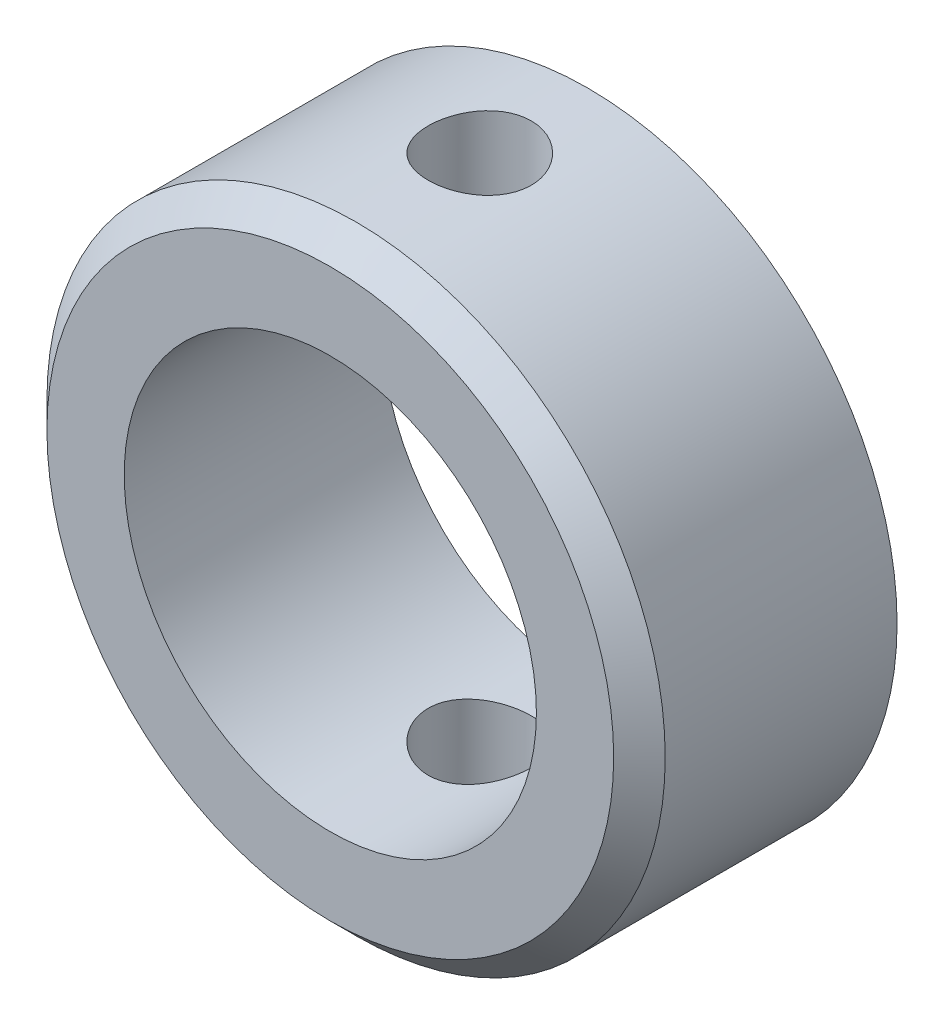
ISO-10303-21;
HEADER;
FILE_DESCRIPTION(('STEP AP214'),'2;1');
FILE_NAME('part.step','',(''),(''),'','','');
FILE_SCHEMA(('AUTOMOTIVE_DESIGN { 1 0 10303 214 1 1 1 1 }'));
ENDSEC;
DATA;
#1=APPLICATION_CONTEXT('core data for automotive mechanical design processes');
#2=APPLICATION_PROTOCOL_DEFINITION('international standard','automotive_design',2000,#1);
#3=PRODUCT_CONTEXT('',#1,'mechanical');
#4=PRODUCT('Part','Part','',(#3));
#5=PRODUCT_RELATED_PRODUCT_CATEGORY('part','',(#4));
#6=PRODUCT_DEFINITION_FORMATION('','',#4);
#7=PRODUCT_DEFINITION_CONTEXT('part definition',#1,'design');
#8=PRODUCT_DEFINITION('design','',#6,#7);
#9=PRODUCT_DEFINITION_SHAPE('','',#8);
#10=(LENGTH_UNIT() NAMED_UNIT(*) SI_UNIT(.MILLI.,.METRE.));
#11=(NAMED_UNIT(*) PLANE_ANGLE_UNIT() SI_UNIT($,.RADIAN.));
#12=(NAMED_UNIT(*) SI_UNIT($,.STERADIAN.) SOLID_ANGLE_UNIT());
#13=UNCERTAINTY_MEASURE_WITH_UNIT(LENGTH_MEASURE(1.E-05),#10,'distance_accuracy_value','');
#14=(GEOMETRIC_REPRESENTATION_CONTEXT(3) GLOBAL_UNCERTAINTY_ASSIGNED_CONTEXT((#13)) GLOBAL_UNIT_ASSIGNED_CONTEXT((#10,
#11,#12)) REPRESENTATION_CONTEXT('',''));
#15=CARTESIAN_POINT('',(0.,0.,0.));
#16=DIRECTION('',(0.,0.,1.));
#17=DIRECTION('',(1.,0.,0.));
#18=AXIS2_PLACEMENT_3D('',#15,#16,#17);
#19=CARTESIAN_POINT('',(0.,0.,10.));
#20=DIRECTION('',(0.,0.,1.));
#21=DIRECTION('',(1.,0.,0.));
#22=AXIS2_PLACEMENT_3D('',#19,#20,#21);
#23=PLANE('',#22);
#24=CARTESIAN_POINT('',(0.,0.,10.));
#25=DIRECTION('',(0.,0.,1.));
#26=DIRECTION('',(1.,0.,0.));
#27=AXIS2_PLACEMENT_3D('',#24,#25,#26);
#28=CIRCLE('',#27,11.);
#29=CARTESIAN_POINT('',(11.,0.,10.));
#30=VERTEX_POINT('',#29);
#31=EDGE_CURVE('E54',#30,#30,#28,.T.);
#32=ORIENTED_EDGE('',*,*,#31,.T.);
#33=EDGE_LOOP('',(#32));
#34=FACE_BOUND('',#33,.T.);
#35=CARTESIAN_POINT('',(0.,0.,10.));
#36=DIRECTION('',(0.,0.,1.));
#37=DIRECTION('',(1.,0.,0.));
#38=AXIS2_PLACEMENT_3D('',#35,#36,#37);
#39=CIRCLE('',#38,8.00000000000001);
#40=CARTESIAN_POINT('',(8.00000000000001,0.,10.));
#41=VERTEX_POINT('',#40);
#42=EDGE_CURVE('E110',#41,#41,#39,.T.);
#43=ORIENTED_EDGE('',*,*,#42,.F.);
#44=EDGE_LOOP('',(#43));
#45=FACE_BOUND('',#44,.T.);
#46=ADVANCED_FACE('F39',(#34,#45),#23,.T.);
#47=CARTESIAN_POINT('',(0.,0.,0.));
#48=DIRECTION('',(0.,0.,1.));
#49=DIRECTION('',(1.,0.,0.));
#50=AXIS2_PLACEMENT_3D('',#47,#48,#49);
#51=PLANE('',#50);
#52=CARTESIAN_POINT('',(0.,0.,0.));
#53=DIRECTION('',(0.,0.,1.));
#54=DIRECTION('',(1.,0.,0.));
#55=AXIS2_PLACEMENT_3D('',#52,#53,#54);
#56=CIRCLE('',#55,12.);
#57=CARTESIAN_POINT('',(12.,0.,0.));
#58=VERTEX_POINT('',#57);
#59=EDGE_CURVE('E60',#58,#58,#56,.T.);
#60=ORIENTED_EDGE('',*,*,#59,.F.);
#61=EDGE_LOOP('',(#60));
#62=FACE_BOUND('',#61,.T.);
#63=CARTESIAN_POINT('',(0.,0.,0.));
#64=DIRECTION('',(0.,0.,1.));
#65=DIRECTION('',(1.,0.,0.));
#66=AXIS2_PLACEMENT_3D('',#63,#64,#65);
#67=CIRCLE('',#66,8.00000000000001);
#68=CARTESIAN_POINT('',(8.00000000000001,0.,0.));
#69=VERTEX_POINT('',#68);
#70=EDGE_CURVE('E113',#69,#69,#67,.T.);
#71=ORIENTED_EDGE('',*,*,#70,.T.);
#72=EDGE_LOOP('',(#71));
#73=FACE_BOUND('',#72,.T.);
#74=ADVANCED_FACE('F97',(#62,#73),#51,.F.);
#75=CARTESIAN_POINT('',(0.,0.,10.));
#76=DIRECTION('',(0.,0.,-1.));
#77=DIRECTION('',(-1.,0.,0.));
#78=AXIS2_PLACEMENT_3D('',#75,#76,#77);
#79=CYLINDRICAL_SURFACE('',#78,12.);
#80=CARTESIAN_POINT('',(0.,-12.,6.2));
#81=CARTESIAN_POINT('',(0.111512723966572,-11.9999980893506,6.19999552884175));
#82=CARTESIAN_POINT('',(0.223086305471057,-11.9984294233043,6.19064218002486));
#83=CARTESIAN_POINT('',(0.443104177338434,-11.9923227595311,6.15349147298774));
#84=CARTESIAN_POINT('',(0.551545494367397,-11.9877820313911,6.12567715447072));
#85=CARTESIAN_POINT('',(0.762083797770115,-11.9762405458916,6.0524676411258));
#86=CARTESIAN_POINT('',(0.86418589474552,-11.9692418012736,6.00708682748754));
#87=CARTESIAN_POINT('',(1.05931347358236,-11.9535538166566,5.90007016635809));
#88=CARTESIAN_POINT('',(1.15233999190287,-11.9448647700355,5.8384361780136));
#89=CARTESIAN_POINT('',(1.32757809143334,-11.9266665396665,5.70003593294363));
#90=CARTESIAN_POINT('',(1.40969032282797,-11.9171509745189,5.6231447082911));
#91=CARTESIAN_POINT('',(1.55991079892794,-11.8984210150139,5.45668162522175));
#92=CARTESIAN_POINT('',(1.62801815951278,-11.8892066397014,5.36710896683471));
#93=CARTESIAN_POINT('',(1.74869370048411,-11.8720605260783,5.17714322704236));
#94=CARTESIAN_POINT('',(1.8011636422888,-11.8641370327331,5.0766869305562));
#95=CARTESIAN_POINT('',(1.88844669232898,-11.8505583183574,4.8682323485595));
#96=CARTESIAN_POINT('',(1.92326099325249,-11.8449029441145,4.7602345730579));
#97=CARTESIAN_POINT('',(1.97393150222785,-11.8365642947421,4.54081578011477));
#98=CARTESIAN_POINT('',(1.98995922330832,-11.8338541478856,4.42943541079889));
#99=CARTESIAN_POINT('',(2.0031333802319,-11.8316315114932,4.20553577849322));
#100=CARTESIAN_POINT('',(2.0002811523112,-11.8321187956577,4.09301659666616));
#101=CARTESIAN_POINT('',(1.97591607871692,-11.8362114309085,3.87125771097964));
#102=CARTESIAN_POINT('',(1.95459590551182,-11.8397845865513,3.76199615716381));
#103=CARTESIAN_POINT('',(1.89420251232276,-11.8495959616881,3.54862294573669));
#104=CARTESIAN_POINT('',(1.85512868345579,-11.8558342725862,3.44451146488916));
#105=CARTESIAN_POINT('',(1.76014179687513,-11.8703078346728,3.24381694124727));
#106=CARTESIAN_POINT('',(1.70414873110377,-11.8785525368586,3.14727247513502));
#107=CARTESIAN_POINT('',(1.57696961404595,-11.8961033473201,2.96487647956929));
#108=CARTESIAN_POINT('',(1.50578233652343,-11.9054095412343,2.87902581403606));
#109=CARTESIAN_POINT('',(1.34918576972724,-11.9241762230383,2.71933913135412));
#110=CARTESIAN_POINT('',(1.2636111710985,-11.9336371938532,2.64566518516793));
#111=CARTESIAN_POINT('',(1.08122819918532,-11.9515408111738,2.51369778986773));
#112=CARTESIAN_POINT('',(0.984419753525138,-11.959983451118,2.45540443985342));
#113=CARTESIAN_POINT('',(0.782164732933369,-11.9749111431433,2.35583821829097));
#114=CARTESIAN_POINT('',(0.676710980451729,-11.9813945472596,2.31457966453499));
#115=CARTESIAN_POINT('',(0.460238676482185,-11.9916600241013,2.25040462780322));
#116=CARTESIAN_POINT('',(0.349220591343574,-11.9954423228038,2.22748661042103));
#117=CARTESIAN_POINT('',(0.126167921041299,-11.9998490387415,2.20086291323109));
#118=CARTESIAN_POINT('',(0.014160589720809,-12.0005100241023,2.19693474255552));
#119=CARTESIAN_POINT('',(-0.20891181831191,-11.9986997953694,2.2078090755425));
#120=CARTESIAN_POINT('',(-0.319976931113631,-11.996228701793,2.22261085850699));
#121=CARTESIAN_POINT('',(-0.537324940437411,-11.9884546155056,2.27033987946838));
#122=CARTESIAN_POINT('',(-0.643632694708303,-11.9831688384105,2.3031569667121));
#123=CARTESIAN_POINT('',(-0.849237507888354,-11.9703557156429,2.38586761455963));
#124=CARTESIAN_POINT('',(-0.948534172727775,-11.9628282440962,2.43576213410822));
#125=CARTESIAN_POINT('',(-1.13826455157517,-11.9462761304193,2.55172089975743));
#126=CARTESIAN_POINT('',(-1.22861220074972,-11.9372388470962,2.6179241249338));
#127=CARTESIAN_POINT('',(-1.39699486840215,-11.9187077391352,2.76442985230805));
#128=CARTESIAN_POINT('',(-1.47502899175727,-11.9092138813724,2.84473337862134));
#129=CARTESIAN_POINT('',(-1.6173942237264,-11.8907214018868,3.01815803845714));
#130=CARTESIAN_POINT('',(-1.68157500889097,-11.8817289290969,3.11140333241153));
#131=CARTESIAN_POINT('',(-1.79336184823599,-11.8653722382231,3.30748237531083));
#132=CARTESIAN_POINT('',(-1.84096842781586,-11.8580079685282,3.410315820182));
#133=CARTESIAN_POINT('',(-1.91803066517852,-11.8457876295816,3.62223178624971));
#134=CARTESIAN_POINT('',(-1.94756114603836,-11.8409212344885,3.73128647602439));
#135=CARTESIAN_POINT('',(-1.98786836302262,-11.8342217346821,3.95289610337741));
#136=CARTESIAN_POINT('',(-1.99864672955693,-11.8323883662618,4.06545073578564));
#137=CARTESIAN_POINT('',(-2.00109829283788,-11.8319738646721,4.28936413276993));
#138=CARTESIAN_POINT('',(-1.99300810890015,-11.8333524520452,4.40072030286023));
#139=CARTESIAN_POINT('',(-1.95846387116548,-11.8391182516298,4.62046339844061));
#140=CARTESIAN_POINT('',(-1.93200987688998,-11.8435054540897,4.7288503335535));
#141=CARTESIAN_POINT('',(-1.86157959167592,-11.8547788502538,4.93948674983409));
#142=CARTESIAN_POINT('',(-1.81762367248035,-11.8616621377574,5.04174320804482));
#143=CARTESIAN_POINT('',(-1.71346160313273,-11.8771549513777,5.23746853535588));
#144=CARTESIAN_POINT('',(-1.65325464699885,-11.8857645631072,5.33093696829771));
#145=CARTESIAN_POINT('',(-1.51745510749772,-11.903867632365,5.5076284664862));
#146=CARTESIAN_POINT('',(-1.44168845087492,-11.9133703646104,5.59071681336022));
#147=CARTESIAN_POINT('',(-1.27728722510418,-11.9321149788867,5.74308128357995));
#148=CARTESIAN_POINT('',(-1.18864969033011,-11.9413568002124,5.81235421491054));
#149=CARTESIAN_POINT('',(-1.00029533571223,-11.9586122371378,5.93555861455996));
#150=CARTESIAN_POINT('',(-0.900506230026255,-11.9666169300248,5.98938083145036));
#151=CARTESIAN_POINT('',(-0.693210455503185,-11.9804093408142,6.07941558768794));
#152=CARTESIAN_POINT('',(-0.585711595864007,-11.9861992654199,6.11564566486376));
#153=CARTESIAN_POINT('',(-0.39816264803632,-11.9936463266637,6.16160421930133));
#154=CARTESIAN_POINT('',(-0.319247064238757,-11.9960162181869,6.17597957569277));
#155=CARTESIAN_POINT('',(-0.160231448255847,-11.999193727889,6.1951789902758));
#156=CARTESIAN_POINT('',(-0.0801314364867952,-12.0000013729651,6.20000321290989));
#157=CARTESIAN_POINT('',(0.,-12.,6.2));
#158=B_SPLINE_CURVE_WITH_KNOTS('',3,(#80,#81,#82,#83,#84,#85,#86,#87,#88,#89,#90,#91,#92,#93,
#94,#95,#96,#97,#98,#99,#100,#101,#102,#103,#104,#105,#106,#107,#108,#109,#110,#111,#112,#113,
#114,#115,#116,#117,#118,#119,#120,#121,#122,#123,#124,#125,#126,#127,#128,#129,#130,#131,#132,
#133,#134,#135,#136,#137,#138,#139,#140,#141,#142,#143,#144,#145,#146,#147,#148,#149,#150,#151,
#152,#153,#154,#155,#156,#157),.UNSPECIFIED.,.T.,.F.,(4,2,2,2,2,2,2,2,2,2,2,2,2,2,2,2,2,2,2,2,2,
2,2,2,2,2,2,2,2,2,2,2,2,2,2,2,2,2,4),(0.,0.334245267950807,0.668798036556336,1.00307749362022,
1.33731873013983,1.67441992849866,2.01154240135885,2.35074016659072,2.68991501500945,
3.02596861682739,3.36199843456709,3.69456417408327,4.02714132020305,4.36131645306046,
4.69551856544459,5.03386215929061,5.37220793308678,5.71083751132723,6.04943875616919,
6.38406306793118,6.71867450428688,7.05126245605132,7.38386908660853,7.71941460501619,
8.05498450443426,8.39403057606095,8.73306589900754,9.07068817873417,9.40828110229294,
9.7416632761816,10.0750443695051,10.4080385458098,10.7410492402347,11.0780110735471,
11.4150506710318,11.7544178528576,12.0934460170406,12.3336339853121,12.5738178182157),.UNSPECIFIED.);
#159=CARTESIAN_POINT('',(0.,-12.,6.2));
#160=VERTEX_POINT('',#159);
#161=EDGE_CURVE('E88',#160,#160,#158,.T.);
#162=ORIENTED_EDGE('',*,*,#161,.T.);
#163=EDGE_LOOP('',(#162));
#164=FACE_BOUND('',#163,.T.);
#165=CARTESIAN_POINT('',(0.,12.,6.2));
#166=CARTESIAN_POINT('',(-0.111512723966572,11.9999980893506,6.19999552884175));
#167=CARTESIAN_POINT('',(-0.223086305471057,11.9984294233043,6.19064218002486));
#168=CARTESIAN_POINT('',(-0.443104177338434,11.9923227595311,6.15349147298774));
#169=CARTESIAN_POINT('',(-0.551545494367397,11.9877820313911,6.12567715447072));
#170=CARTESIAN_POINT('',(-0.762083797770115,11.9762405458916,6.0524676411258));
#171=CARTESIAN_POINT('',(-0.86418589474552,11.9692418012736,6.00708682748754));
#172=CARTESIAN_POINT('',(-1.05931347358236,11.9535538166566,5.90007016635809));
#173=CARTESIAN_POINT('',(-1.15233999190287,11.9448647700355,5.8384361780136));
#174=CARTESIAN_POINT('',(-1.32757809143334,11.9266665396665,5.70003593294363));
#175=CARTESIAN_POINT('',(-1.40969032282797,11.9171509745189,5.6231447082911));
#176=CARTESIAN_POINT('',(-1.55991079892794,11.8984210150139,5.45668162522175));
#177=CARTESIAN_POINT('',(-1.62801815951278,11.8892066397014,5.36710896683471));
#178=CARTESIAN_POINT('',(-1.74869370048411,11.8720605260783,5.17714322704236));
#179=CARTESIAN_POINT('',(-1.8011636422888,11.8641370327331,5.0766869305562));
#180=CARTESIAN_POINT('',(-1.88844669232898,11.8505583183574,4.8682323485595));
#181=CARTESIAN_POINT('',(-1.92326099325249,11.8449029441145,4.7602345730579));
#182=CARTESIAN_POINT('',(-1.97393150222785,11.8365642947421,4.54081578011477));
#183=CARTESIAN_POINT('',(-1.98995922330832,11.8338541478856,4.42943541079889));
#184=CARTESIAN_POINT('',(-2.0031333802319,11.8316315114932,4.20553577849322));
#185=CARTESIAN_POINT('',(-2.0002811523112,11.8321187956577,4.09301659666616));
#186=CARTESIAN_POINT('',(-1.97591607871692,11.8362114309085,3.87125771097964));
#187=CARTESIAN_POINT('',(-1.95459590551182,11.8397845865513,3.76199615716381));
#188=CARTESIAN_POINT('',(-1.89420251232276,11.8495959616881,3.54862294573669));
#189=CARTESIAN_POINT('',(-1.85512868345579,11.8558342725862,3.44451146488916));
#190=CARTESIAN_POINT('',(-1.76014179687513,11.8703078346728,3.24381694124727));
#191=CARTESIAN_POINT('',(-1.70414873110377,11.8785525368586,3.14727247513502));
#192=CARTESIAN_POINT('',(-1.57696961404595,11.8961033473201,2.96487647956929));
#193=CARTESIAN_POINT('',(-1.50578233652343,11.9054095412343,2.87902581403606));
#194=CARTESIAN_POINT('',(-1.34918576972724,11.9241762230383,2.71933913135412));
#195=CARTESIAN_POINT('',(-1.2636111710985,11.9336371938532,2.64566518516793));
#196=CARTESIAN_POINT('',(-1.08122819918532,11.9515408111738,2.51369778986773));
#197=CARTESIAN_POINT('',(-0.984419753525138,11.959983451118,2.45540443985342));
#198=CARTESIAN_POINT('',(-0.782164732933369,11.9749111431433,2.35583821829097));
#199=CARTESIAN_POINT('',(-0.676710980451729,11.9813945472596,2.31457966453499));
#200=CARTESIAN_POINT('',(-0.460238676482185,11.9916600241013,2.25040462780322));
#201=CARTESIAN_POINT('',(-0.349220591343574,11.9954423228038,2.22748661042103));
#202=CARTESIAN_POINT('',(-0.126167921041299,11.9998490387415,2.20086291323109));
#203=CARTESIAN_POINT('',(-0.014160589720809,12.0005100241023,2.19693474255552));
#204=CARTESIAN_POINT('',(0.20891181831191,11.9986997953694,2.2078090755425));
#205=CARTESIAN_POINT('',(0.319976931113631,11.996228701793,2.22261085850699));
#206=CARTESIAN_POINT('',(0.537324940437411,11.9884546155056,2.27033987946838));
#207=CARTESIAN_POINT('',(0.643632694708303,11.9831688384105,2.3031569667121));
#208=CARTESIAN_POINT('',(0.849237507888354,11.9703557156429,2.38586761455963));
#209=CARTESIAN_POINT('',(0.948534172727775,11.9628282440962,2.43576213410822));
#210=CARTESIAN_POINT('',(1.13826455157517,11.9462761304193,2.55172089975743));
#211=CARTESIAN_POINT('',(1.22861220074972,11.9372388470962,2.6179241249338));
#212=CARTESIAN_POINT('',(1.39699486840215,11.9187077391352,2.76442985230805));
#213=CARTESIAN_POINT('',(1.47502899175727,11.9092138813724,2.84473337862134));
#214=CARTESIAN_POINT('',(1.6173942237264,11.8907214018868,3.01815803845714));
#215=CARTESIAN_POINT('',(1.68157500889097,11.8817289290969,3.11140333241153));
#216=CARTESIAN_POINT('',(1.79336184823599,11.8653722382231,3.30748237531083));
#217=CARTESIAN_POINT('',(1.84096842781586,11.8580079685282,3.410315820182));
#218=CARTESIAN_POINT('',(1.91803066517852,11.8457876295816,3.62223178624971));
#219=CARTESIAN_POINT('',(1.94756114603836,11.8409212344885,3.73128647602439));
#220=CARTESIAN_POINT('',(1.98786836302262,11.8342217346821,3.95289610337741));
#221=CARTESIAN_POINT('',(1.99864672955693,11.8323883662618,4.06545073578564));
#222=CARTESIAN_POINT('',(2.00109829283788,11.8319738646721,4.28936413276993));
#223=CARTESIAN_POINT('',(1.99300810890015,11.8333524520452,4.40072030286023));
#224=CARTESIAN_POINT('',(1.95846387116548,11.8391182516298,4.62046339844061));
#225=CARTESIAN_POINT('',(1.93200987688998,11.8435054540897,4.7288503335535));
#226=CARTESIAN_POINT('',(1.86157959167592,11.8547788502538,4.93948674983409));
#227=CARTESIAN_POINT('',(1.81762367248035,11.8616621377574,5.04174320804482));
#228=CARTESIAN_POINT('',(1.71346160313273,11.8771549513777,5.23746853535588));
#229=CARTESIAN_POINT('',(1.65325464699885,11.8857645631072,5.33093696829771));
#230=CARTESIAN_POINT('',(1.51745510749772,11.903867632365,5.5076284664862));
#231=CARTESIAN_POINT('',(1.44168845087492,11.9133703646104,5.59071681336022));
#232=CARTESIAN_POINT('',(1.27728722510418,11.9321149788867,5.74308128357995));
#233=CARTESIAN_POINT('',(1.18864969033011,11.9413568002124,5.81235421491054));
#234=CARTESIAN_POINT('',(1.00029533571223,11.9586122371378,5.93555861455996));
#235=CARTESIAN_POINT('',(0.900506230026255,11.9666169300248,5.98938083145036));
#236=CARTESIAN_POINT('',(0.693210455503185,11.9804093408142,6.07941558768794));
#237=CARTESIAN_POINT('',(0.585711595864007,11.9861992654199,6.11564566486376));
#238=CARTESIAN_POINT('',(0.39816264803632,11.9936463266637,6.16160421930133));
#239=CARTESIAN_POINT('',(0.319247064238757,11.9960162181869,6.17597957569277));
#240=CARTESIAN_POINT('',(0.160231448255847,11.999193727889,6.1951789902758));
#241=CARTESIAN_POINT('',(0.0801314364867952,12.0000013729651,6.20000321290989));
#242=CARTESIAN_POINT('',(0.,12.,6.2));
#243=B_SPLINE_CURVE_WITH_KNOTS('',3,(#165,#166,#167,#168,#169,#170,#171,#172,#173,#174,#175,
#176,#177,#178,#179,#180,#181,#182,#183,#184,#185,#186,#187,#188,#189,#190,#191,#192,#193,#194,
#195,#196,#197,#198,#199,#200,#201,#202,#203,#204,#205,#206,#207,#208,#209,#210,#211,#212,#213,
#214,#215,#216,#217,#218,#219,#220,#221,#222,#223,#224,#225,#226,#227,#228,#229,#230,#231,#232,
#233,#234,#235,#236,#237,#238,#239,#240,#241,#242),.UNSPECIFIED.,.T.,.F.,(4,2,2,2,2,2,2,2,2,2,2,
2,2,2,2,2,2,2,2,2,2,2,2,2,2,2,2,2,2,2,2,2,2,2,2,2,2,2,4),(0.,0.334245267950807,
0.668798036556336,1.00307749362022,1.33731873013983,1.67441992849866,2.01154240135885,
2.35074016659072,2.68991501500945,3.02596861682739,3.36199843456709,3.69456417408327,
4.02714132020305,4.36131645306046,4.69551856544459,5.03386215929061,5.37220793308678,
5.71083751132723,6.04943875616919,6.38406306793118,6.71867450428688,7.05126245605132,
7.38386908660853,7.71941460501619,8.05498450443426,8.39403057606095,8.73306589900754,
9.07068817873417,9.40828110229294,9.7416632761816,10.0750443695051,10.4080385458098,
10.7410492402347,11.0780110735471,11.4150506710318,11.7544178528576,12.0934460170406,
12.3336339853121,12.5738178182157),.UNSPECIFIED.);
#244=CARTESIAN_POINT('',(0.,12.,6.2));
#245=VERTEX_POINT('',#244);
#246=EDGE_CURVE('E82',#245,#245,#243,.T.);
#247=ORIENTED_EDGE('',*,*,#246,.T.);
#248=EDGE_LOOP('',(#247));
#249=FACE_BOUND('',#248,.T.);
#250=CARTESIAN_POINT('',(0.,0.,9.00000000000001));
#251=DIRECTION('',(0.,0.,1.));
#252=DIRECTION('',(1.,0.,0.));
#253=AXIS2_PLACEMENT_3D('',#250,#251,#252);
#254=CIRCLE('',#253,12.);
#255=CARTESIAN_POINT('',(12.,0.,9.00000000000001));
#256=VERTEX_POINT('',#255);
#257=EDGE_CURVE('E10',#256,#256,#254,.F.);
#258=ORIENTED_EDGE('',*,*,#257,.T.);
#259=EDGE_LOOP('',(#258));
#260=FACE_BOUND('',#259,.T.);
#261=ORIENTED_EDGE('',*,*,#59,.T.);
#262=EDGE_LOOP('',(#261));
#263=FACE_BOUND('',#262,.T.);
#264=ADVANCED_FACE('F93',(#164,#249,#260,#263),#79,.T.);
#265=CARTESIAN_POINT('',(0.,0.,10.));
#266=DIRECTION('',(0.,0.,-1.));
#267=DIRECTION('',(-1.,0.,0.));
#268=AXIS2_PLACEMENT_3D('',#265,#266,#267);
#269=CYLINDRICAL_SURFACE('',#268,8.00000000000001);
#270=CARTESIAN_POINT('',(0.,-8.00000000000001,6.2));
#271=CARTESIAN_POINT('',(0.110501451559641,-7.9999981315735,6.19999689901579));
#272=CARTESIAN_POINT('',(0.221037543774351,-7.99768770842436,6.19081126563495));
#273=CARTESIAN_POINT('',(0.438941765027377,-7.98869485106526,6.15436646492399));
#274=CARTESIAN_POINT('',(0.546308062494319,-7.98200993893302,6.12709705394953));
#275=CARTESIAN_POINT('',(0.754694496243435,-7.96500835109377,6.05541432871722));
#276=CARTESIAN_POINT('',(0.855722084573336,-7.95469603789412,6.01102160171297));
#277=CARTESIAN_POINT('',(1.04889617587257,-7.93153791743496,5.90642481327354));
#278=CARTESIAN_POINT('',(1.14104237913168,-7.91869202472209,5.84622021850805));
#279=CARTESIAN_POINT('',(1.31573590306789,-7.89156551455592,5.71039894712776));
#280=CARTESIAN_POINT('',(1.39807425341474,-7.87726276197502,5.63451790005459));
#281=CARTESIAN_POINT('',(1.54899856960443,-7.84898160157249,5.47006372678795));
#282=CARTESIAN_POINT('',(1.61758298259892,-7.83500323053157,5.38148916940409));
#283=CARTESIAN_POINT('',(1.74003539039863,-7.80873034264225,5.19253969768401));
#284=CARTESIAN_POINT('',(1.79366962123352,-7.79646392619749,5.09200902558836));
#285=CARTESIAN_POINT('',(1.88319587806766,-7.77532659757356,4.88300211778662));
#286=CARTESIAN_POINT('',(1.91909074058685,-7.76645514259225,4.77452715555731));
#287=CARTESIAN_POINT('',(1.97140644907302,-7.75333968928431,4.55500866906445));
#288=CARTESIAN_POINT('',(1.98820302444274,-7.74900654662682,4.44406013861601));
#289=CARTESIAN_POINT('',(2.00301570008854,-7.74519149946123,4.22084190800087));
#290=CARTESIAN_POINT('',(2.00103485575748,-7.74570880570572,4.10857242574382));
#291=CARTESIAN_POINT('',(1.97864869951961,-7.75145607355757,3.8887789230062));
#292=CARTESIAN_POINT('',(1.95869112025418,-7.75657150676392,3.78120583804623));
#293=CARTESIAN_POINT('',(1.90163224920399,-7.77075612894759,3.57098526545192));
#294=CARTESIAN_POINT('',(1.86452973609252,-7.77982559958985,3.46833812929477));
#295=CARTESIAN_POINT('',(1.77385263724958,-7.80100151874213,3.26968264499716));
#296=CARTESIAN_POINT('',(1.72011555631056,-7.81313769959755,3.17375177094724));
#297=CARTESIAN_POINT('',(1.59780836801993,-7.83906281127989,2.99210838699091));
#298=CARTESIAN_POINT('',(1.52923566507845,-7.85285203112838,2.90639766924367));
#299=CARTESIAN_POINT('',(1.37688456624163,-7.88101174053189,2.74506184574079));
#300=CARTESIAN_POINT('',(1.29272834422115,-7.89538759304002,2.66979401325153));
#301=CARTESIAN_POINT('',(1.11281589000493,-7.92274620771676,2.5343716767148));
#302=CARTESIAN_POINT('',(1.01705930361059,-7.93572892732544,2.47421763431525));
#303=CARTESIAN_POINT('',(0.816154518241856,-7.95890309458921,2.37059921836749));
#304=CARTESIAN_POINT('',(0.710975190944831,-7.96908480170304,2.32719287966076));
#305=CARTESIAN_POINT('',(0.49450134419051,-7.98543889321889,2.25877692572057));
#306=CARTESIAN_POINT('',(0.383207998867313,-7.99161204452374,2.23376379144248));
#307=CARTESIAN_POINT('',(0.160719960520036,-7.99913999028501,2.20338991258822));
#308=CARTESIAN_POINT('',(0.0495956266509469,-8.00061404677706,2.1975426318996));
#309=CARTESIAN_POINT('',(-0.172043833068677,-7.99891739752602,2.20433200274065));
#310=CARTESIAN_POINT('',(-0.282559012859459,-7.99574710989129,2.21696699039884));
#311=CARTESIAN_POINT('',(-0.498152358368655,-7.98519441503143,2.25996121118851));
#312=CARTESIAN_POINT('',(-0.603286825291673,-7.97787512247749,2.29005501796932));
#313=CARTESIAN_POINT('',(-0.807009723270015,-7.95984942178846,2.36680944537126));
#314=CARTESIAN_POINT('',(-0.905597492043513,-7.94914267159857,2.41347173908423));
#315=CARTESIAN_POINT('',(-1.0953641792398,-7.92524410568415,2.5229815051663));
#316=CARTESIAN_POINT('',(-1.18638058911444,-7.91201156489244,2.58610148319568));
#317=CARTESIAN_POINT('',(-1.35670215152433,-7.88459345583227,2.72638654506263));
#318=CARTESIAN_POINT('',(-1.43600527863068,-7.87040772335607,2.80355405282254));
#319=CARTESIAN_POINT('',(-1.58265409076364,-7.84225275947695,2.97200261445929));
#320=CARTESIAN_POINT('',(-1.64965849016271,-7.82829738916375,3.06358360400323));
#321=CARTESIAN_POINT('',(-1.7673476786836,-7.80257171169652,3.25697684595429));
#322=CARTESIAN_POINT('',(-1.81803319221058,-7.79080130756036,3.35878864394634));
#323=CARTESIAN_POINT('',(-1.90126856081239,-7.77090792979554,3.5692076298841));
#324=CARTESIAN_POINT('',(-1.93392586220542,-7.76276340389208,3.67777017112535));
#325=CARTESIAN_POINT('',(-1.98046087993837,-7.75102325453579,3.89907951718548));
#326=CARTESIAN_POINT('',(-1.99434270330488,-7.74742663626582,4.01182540137665));
#327=CARTESIAN_POINT('',(-2.00271812044533,-7.7452653493861,4.23482803180694));
#328=CARTESIAN_POINT('',(-1.99775719704016,-7.74655910304352,4.34506324683298));
#329=CARTESIAN_POINT('',(-1.96983637108382,-7.75370545343791,4.56307185155731));
#330=CARTESIAN_POINT('',(-1.94687683024902,-7.7595579585581,4.67084529068487));
#331=CARTESIAN_POINT('',(-1.88390842592373,-7.77508347576964,4.88027794542054));
#332=CARTESIAN_POINT('',(-1.84400187290717,-7.78473353648413,4.98196974032028));
#333=CARTESIAN_POINT('',(-1.74835321814009,-7.80677007633105,5.17728717695159));
#334=CARTESIAN_POINT('',(-1.69260892004558,-7.81915693494365,5.27091169758256));
#335=CARTESIAN_POINT('',(-1.56515699818285,-7.8456751235135,5.45007283866936));
#336=CARTESIAN_POINT('',(-1.49307088388301,-7.8598435310901,5.53533476456528));
#337=CARTESIAN_POINT('',(-1.33571916158631,-7.88810702995048,5.69272939306054));
#338=CARTESIAN_POINT('',(-1.25045042834819,-7.90220210302747,5.76485897348396));
#339=CARTESIAN_POINT('',(-1.06729011560345,-7.92903540863552,5.89521507808614));
#340=CARTESIAN_POINT('',(-0.969197896421849,-7.94174444487825,5.95316615156211));
#341=CARTESIAN_POINT('',(-0.764354746013968,-7.96406566633492,6.05166328392071));
#342=CARTESIAN_POINT('',(-0.657610084582319,-7.97368006933042,6.09222181419805));
#343=CARTESIAN_POINT('',(-0.459213670991295,-7.98730746087389,6.14876244043954));
#344=CARTESIAN_POINT('',(-0.368506894544091,-7.99203446736921,6.16793499073791));
#345=CARTESIAN_POINT('',(-0.185208095381711,-7.99838140309265,6.19355459149592));
#346=CARTESIAN_POINT('',(-0.0926162149901549,-8.00000156601193,6.20000259907374));
#347=CARTESIAN_POINT('',(0.,-8.00000000000001,6.2));
#348=B_SPLINE_CURVE_WITH_KNOTS('',3,(#270,#271,#272,#273,#274,#275,#276,#277,#278,#279,#280,
#281,#282,#283,#284,#285,#286,#287,#288,#289,#290,#291,#292,#293,#294,#295,#296,#297,#298,#299,
#300,#301,#302,#303,#304,#305,#306,#307,#308,#309,#310,#311,#312,#313,#314,#315,#316,#317,#318,
#319,#320,#321,#322,#323,#324,#325,#326,#327,#328,#329,#330,#331,#332,#333,#334,#335,#336,#337,
#338,#339,#340,#341,#342,#343,#344,#345,#346,#347),.UNSPECIFIED.,.T.,.F.,(4,2,2,2,2,2,2,2,2,2,2,
2,2,2,2,2,2,2,2,2,2,2,2,2,2,2,2,2,2,2,2,2,2,2,2,2,2,2,4),(0.,0.33116494996252,0.662517650351866,
0.99347320304814,1.32443992022577,1.66152580582852,1.99864972773416,2.34078196727743,
2.68285948225825,3.01808393468093,3.3532538415469,3.68029996013785,4.00736937959145,
4.337740371696,4.66816921119311,5.00802001296453,5.34788119415424,5.6889097201658,
6.02987298255951,6.36211078603462,6.69431868154751,7.02160366023144,7.34892169767481,
7.68204783424897,8.01523150681786,8.35659345610395,8.69794025003772,9.03723006156476,
9.37644564340971,9.70591707202578,10.0353818794581,10.3628853408369,10.6904342418696,
11.0265276855097,11.3627009303165,11.7049624733721,12.0469781843289,12.3245632392729,
12.6021274139515),.UNSPECIFIED.);
#349=CARTESIAN_POINT('',(0.,-8.00000000000001,6.2));
#350=VERTEX_POINT('',#349);
#351=EDGE_CURVE('E44',#350,#350,#348,.T.);
#352=ORIENTED_EDGE('',*,*,#351,.F.);
#353=EDGE_LOOP('',(#352));
#354=FACE_BOUND('',#353,.T.);
#355=CARTESIAN_POINT('',(0.,8.00000000000001,6.2));
#356=CARTESIAN_POINT('',(-0.110501451559641,7.9999981315735,6.19999689901579));
#357=CARTESIAN_POINT('',(-0.221037543774351,7.99768770842436,6.19081126563495));
#358=CARTESIAN_POINT('',(-0.438941765027377,7.98869485106526,6.15436646492399));
#359=CARTESIAN_POINT('',(-0.546308062494319,7.98200993893302,6.12709705394953));
#360=CARTESIAN_POINT('',(-0.754694496243435,7.96500835109377,6.05541432871722));
#361=CARTESIAN_POINT('',(-0.855722084573336,7.95469603789412,6.01102160171297));
#362=CARTESIAN_POINT('',(-1.04889617587257,7.93153791743496,5.90642481327354));
#363=CARTESIAN_POINT('',(-1.14104237913168,7.91869202472209,5.84622021850805));
#364=CARTESIAN_POINT('',(-1.31573590306789,7.89156551455592,5.71039894712776));
#365=CARTESIAN_POINT('',(-1.39807425341474,7.87726276197502,5.63451790005459));
#366=CARTESIAN_POINT('',(-1.54899856960443,7.84898160157249,5.47006372678795));
#367=CARTESIAN_POINT('',(-1.61758298259892,7.83500323053157,5.38148916940409));
#368=CARTESIAN_POINT('',(-1.74003539039863,7.80873034264225,5.19253969768401));
#369=CARTESIAN_POINT('',(-1.79366962123352,7.79646392619749,5.09200902558836));
#370=CARTESIAN_POINT('',(-1.88319587806766,7.77532659757356,4.88300211778662));
#371=CARTESIAN_POINT('',(-1.91909074058685,7.76645514259225,4.77452715555731));
#372=CARTESIAN_POINT('',(-1.97140644907302,7.75333968928431,4.55500866906445));
#373=CARTESIAN_POINT('',(-1.98820302444274,7.74900654662682,4.44406013861601));
#374=CARTESIAN_POINT('',(-2.00301570008854,7.74519149946123,4.22084190800087));
#375=CARTESIAN_POINT('',(-2.00103485575748,7.74570880570572,4.10857242574382));
#376=CARTESIAN_POINT('',(-1.97864869951961,7.75145607355757,3.8887789230062));
#377=CARTESIAN_POINT('',(-1.95869112025418,7.75657150676392,3.78120583804623));
#378=CARTESIAN_POINT('',(-1.90163224920399,7.77075612894759,3.57098526545192));
#379=CARTESIAN_POINT('',(-1.86452973609252,7.77982559958985,3.46833812929477));
#380=CARTESIAN_POINT('',(-1.77385263724958,7.80100151874213,3.26968264499716));
#381=CARTESIAN_POINT('',(-1.72011555631056,7.81313769959755,3.17375177094724));
#382=CARTESIAN_POINT('',(-1.59780836801993,7.83906281127989,2.99210838699091));
#383=CARTESIAN_POINT('',(-1.52923566507845,7.85285203112838,2.90639766924367));
#384=CARTESIAN_POINT('',(-1.37688456624163,7.88101174053189,2.74506184574079));
#385=CARTESIAN_POINT('',(-1.29272834422115,7.89538759304002,2.66979401325153));
#386=CARTESIAN_POINT('',(-1.11281589000493,7.92274620771676,2.5343716767148));
#387=CARTESIAN_POINT('',(-1.01705930361059,7.93572892732544,2.47421763431525));
#388=CARTESIAN_POINT('',(-0.816154518241856,7.95890309458921,2.37059921836749));
#389=CARTESIAN_POINT('',(-0.710975190944831,7.96908480170304,2.32719287966076));
#390=CARTESIAN_POINT('',(-0.49450134419051,7.98543889321889,2.25877692572057));
#391=CARTESIAN_POINT('',(-0.383207998867313,7.99161204452374,2.23376379144248));
#392=CARTESIAN_POINT('',(-0.160719960520036,7.99913999028501,2.20338991258822));
#393=CARTESIAN_POINT('',(-0.0495956266509469,8.00061404677706,2.1975426318996));
#394=CARTESIAN_POINT('',(0.172043833068677,7.99891739752602,2.20433200274065));
#395=CARTESIAN_POINT('',(0.282559012859459,7.99574710989129,2.21696699039884));
#396=CARTESIAN_POINT('',(0.498152358368655,7.98519441503143,2.25996121118851));
#397=CARTESIAN_POINT('',(0.603286825291673,7.97787512247749,2.29005501796932));
#398=CARTESIAN_POINT('',(0.807009723270015,7.95984942178846,2.36680944537126));
#399=CARTESIAN_POINT('',(0.905597492043513,7.94914267159857,2.41347173908423));
#400=CARTESIAN_POINT('',(1.0953641792398,7.92524410568415,2.5229815051663));
#401=CARTESIAN_POINT('',(1.18638058911444,7.91201156489244,2.58610148319568));
#402=CARTESIAN_POINT('',(1.35670215152433,7.88459345583227,2.72638654506263));
#403=CARTESIAN_POINT('',(1.43600527863068,7.87040772335607,2.80355405282254));
#404=CARTESIAN_POINT('',(1.58265409076364,7.84225275947695,2.97200261445929));
#405=CARTESIAN_POINT('',(1.64965849016271,7.82829738916375,3.06358360400323));
#406=CARTESIAN_POINT('',(1.7673476786836,7.80257171169652,3.25697684595429));
#407=CARTESIAN_POINT('',(1.81803319221058,7.79080130756036,3.35878864394634));
#408=CARTESIAN_POINT('',(1.90126856081239,7.77090792979554,3.5692076298841));
#409=CARTESIAN_POINT('',(1.93392586220542,7.76276340389208,3.67777017112535));
#410=CARTESIAN_POINT('',(1.98046087993837,7.75102325453579,3.89907951718548));
#411=CARTESIAN_POINT('',(1.99434270330488,7.74742663626582,4.01182540137665));
#412=CARTESIAN_POINT('',(2.00271812044533,7.7452653493861,4.23482803180694));
#413=CARTESIAN_POINT('',(1.99775719704016,7.74655910304352,4.34506324683298));
#414=CARTESIAN_POINT('',(1.96983637108382,7.75370545343791,4.56307185155731));
#415=CARTESIAN_POINT('',(1.94687683024902,7.7595579585581,4.67084529068487));
#416=CARTESIAN_POINT('',(1.88390842592373,7.77508347576964,4.88027794542054));
#417=CARTESIAN_POINT('',(1.84400187290717,7.78473353648413,4.98196974032028));
#418=CARTESIAN_POINT('',(1.74835321814009,7.80677007633105,5.17728717695159));
#419=CARTESIAN_POINT('',(1.69260892004558,7.81915693494365,5.27091169758256));
#420=CARTESIAN_POINT('',(1.56515699818285,7.8456751235135,5.45007283866936));
#421=CARTESIAN_POINT('',(1.49307088388301,7.8598435310901,5.53533476456528));
#422=CARTESIAN_POINT('',(1.33571916158631,7.88810702995048,5.69272939306054));
#423=CARTESIAN_POINT('',(1.25045042834819,7.90220210302747,5.76485897348396));
#424=CARTESIAN_POINT('',(1.06729011560345,7.92903540863552,5.89521507808614));
#425=CARTESIAN_POINT('',(0.969197896421849,7.94174444487825,5.95316615156211));
#426=CARTESIAN_POINT('',(0.764354746013968,7.96406566633492,6.05166328392071));
#427=CARTESIAN_POINT('',(0.657610084582319,7.97368006933042,6.09222181419805));
#428=CARTESIAN_POINT('',(0.459213670991295,7.98730746087389,6.14876244043954));
#429=CARTESIAN_POINT('',(0.368506894544091,7.99203446736921,6.16793499073791));
#430=CARTESIAN_POINT('',(0.185208095381711,7.99838140309265,6.19355459149592));
#431=CARTESIAN_POINT('',(0.0926162149901549,8.00000156601193,6.20000259907374));
#432=CARTESIAN_POINT('',(0.,8.00000000000001,6.2));
#433=B_SPLINE_CURVE_WITH_KNOTS('',3,(#355,#356,#357,#358,#359,#360,#361,#362,#363,#364,#365,
#366,#367,#368,#369,#370,#371,#372,#373,#374,#375,#376,#377,#378,#379,#380,#381,#382,#383,#384,
#385,#386,#387,#388,#389,#390,#391,#392,#393,#394,#395,#396,#397,#398,#399,#400,#401,#402,#403,
#404,#405,#406,#407,#408,#409,#410,#411,#412,#413,#414,#415,#416,#417,#418,#419,#420,#421,#422,
#423,#424,#425,#426,#427,#428,#429,#430,#431,#432),.UNSPECIFIED.,.T.,.F.,(4,2,2,2,2,2,2,2,2,2,2,
2,2,2,2,2,2,2,2,2,2,2,2,2,2,2,2,2,2,2,2,2,2,2,2,2,2,2,4),(0.,0.33116494996252,0.662517650351866,
0.99347320304814,1.32443992022577,1.66152580582852,1.99864972773416,2.34078196727743,
2.68285948225825,3.01808393468093,3.3532538415469,3.68029996013785,4.00736937959145,
4.337740371696,4.66816921119311,5.00802001296453,5.34788119415424,5.6889097201658,
6.02987298255951,6.36211078603462,6.69431868154751,7.02160366023144,7.34892169767481,
7.68204783424897,8.01523150681786,8.35659345610395,8.69794025003772,9.03723006156476,
9.37644564340971,9.70591707202578,10.0353818794581,10.3628853408369,10.6904342418696,
11.0265276855097,11.3627009303165,11.7049624733721,12.0469781843289,12.3245632392729,
12.6021274139515),.UNSPECIFIED.);
#434=CARTESIAN_POINT('',(0.,8.00000000000001,6.2));
#435=VERTEX_POINT('',#434);
#436=EDGE_CURVE('E63',#435,#435,#433,.T.);
#437=ORIENTED_EDGE('',*,*,#436,.F.);
#438=EDGE_LOOP('',(#437));
#439=FACE_BOUND('',#438,.T.);
#440=ORIENTED_EDGE('',*,*,#42,.T.);
#441=EDGE_LOOP('',(#440));
#442=FACE_BOUND('',#441,.T.);
#443=ORIENTED_EDGE('',*,*,#70,.F.);
#444=EDGE_LOOP('',(#443));
#445=FACE_BOUND('',#444,.T.);
#446=ADVANCED_FACE('F69',(#354,#439,#442,#445),#269,.F.);
#447=CARTESIAN_POINT('',(0.,0.,10.));
#448=DIRECTION('',(0.,0.,-1.));
#449=DIRECTION('',(-1.,0.,0.));
#450=AXIS2_PLACEMENT_3D('',#447,#448,#449);
#451=CONICAL_SURFACE('',#450,11.,0.785398163397445);
#452=ORIENTED_EDGE('',*,*,#257,.F.);
#453=EDGE_LOOP('',(#452));
#454=FACE_BOUND('',#453,.T.);
#455=ORIENTED_EDGE('',*,*,#31,.F.);
#456=EDGE_LOOP('',(#455));
#457=FACE_BOUND('',#456,.T.);
#458=ADVANCED_FACE('F42',(#454,#457),#451,.T.);
#459=CARTESIAN_POINT('',(0.,-27.,4.2));
#460=DIRECTION('',(0.,1.,0.));
#461=DIRECTION('',(0.,0.,1.));
#462=AXIS2_PLACEMENT_3D('',#459,#460,#461);
#463=CYLINDRICAL_SURFACE('',#462,2.);
#464=ORIENTED_EDGE('',*,*,#436,.T.);
#465=EDGE_LOOP('',(#464));
#466=FACE_BOUND('',#465,.T.);
#467=ORIENTED_EDGE('',*,*,#246,.F.);
#468=EDGE_LOOP('',(#467));
#469=FACE_BOUND('',#468,.T.);
#470=ADVANCED_FACE('F75',(#466,#469),#463,.F.);
#471=ORIENTED_EDGE('',*,*,#351,.T.);
#472=EDGE_LOOP('',(#471));
#473=FACE_BOUND('',#472,.T.);
#474=ORIENTED_EDGE('',*,*,#161,.F.);
#475=EDGE_LOOP('',(#474));
#476=FACE_BOUND('',#475,.T.);
#477=ADVANCED_FACE('F72',(#473,#476),#463,.F.);
#478=CLOSED_SHELL('',(#46,#74,#264,#446,#458,#470,#477));
#479=MANIFOLD_SOLID_BREP('B2',#478);
#480=ADVANCED_BREP_SHAPE_REPRESENTATION('',(#18,#479),#14);
#481=SHAPE_DEFINITION_REPRESENTATION(#9,#480);
ENDSEC;
END-ISO-10303-21;
